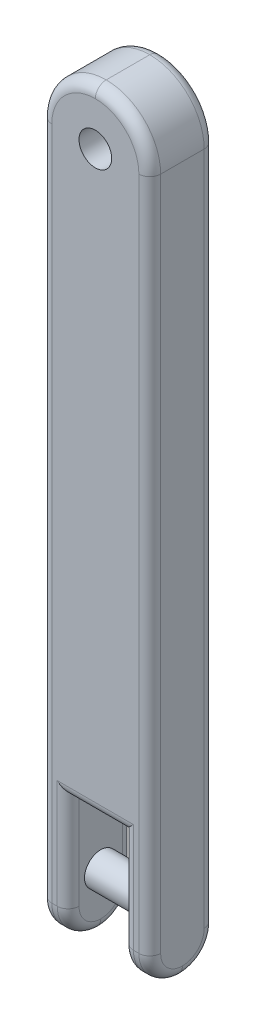
ISO-10303-21;
HEADER;
FILE_DESCRIPTION(('STEP AP214'),'2;1');
FILE_NAME('part.step','',(''),(''),'','','');
FILE_SCHEMA(('AUTOMOTIVE_DESIGN { 1 0 10303 214 1 1 1 1 }'));
ENDSEC;
DATA;
#1=APPLICATION_CONTEXT('core data for automotive mechanical design processes');
#2=APPLICATION_PROTOCOL_DEFINITION('international standard','automotive_design',2000,#1);
#3=PRODUCT_CONTEXT('',#1,'mechanical');
#4=PRODUCT('Part','Part','',(#3));
#5=PRODUCT_RELATED_PRODUCT_CATEGORY('part','',(#4));
#6=PRODUCT_DEFINITION_FORMATION('','',#4);
#7=PRODUCT_DEFINITION_CONTEXT('part definition',#1,'design');
#8=PRODUCT_DEFINITION('design','',#6,#7);
#9=PRODUCT_DEFINITION_SHAPE('','',#8);
#10=(LENGTH_UNIT() NAMED_UNIT(*) SI_UNIT(.MILLI.,.METRE.));
#11=(NAMED_UNIT(*) PLANE_ANGLE_UNIT() SI_UNIT($,.RADIAN.));
#12=(NAMED_UNIT(*) SI_UNIT($,.STERADIAN.) SOLID_ANGLE_UNIT());
#13=UNCERTAINTY_MEASURE_WITH_UNIT(LENGTH_MEASURE(1.E-05),#10,'distance_accuracy_value','');
#14=(GEOMETRIC_REPRESENTATION_CONTEXT(3) GLOBAL_UNCERTAINTY_ASSIGNED_CONTEXT((#13)) GLOBAL_UNIT_ASSIGNED_CONTEXT((#10,
#11,#12)) REPRESENTATION_CONTEXT('',''));
#15=CARTESIAN_POINT('',(0.,0.,0.));
#16=DIRECTION('',(0.,0.,1.));
#17=DIRECTION('',(1.,0.,0.));
#18=AXIS2_PLACEMENT_3D('',#15,#16,#17);
#19=CARTESIAN_POINT('',(0.,0.,30.));
#20=DIRECTION('',(1.,0.,0.));
#21=DIRECTION('',(0.,0.,-1.));
#22=AXIS2_PLACEMENT_3D('',#19,#20,#21);
#23=PLANE('',#22);
#24=CARTESIAN_POINT('',(0.,15.,15.));
#25=DIRECTION('',(1.,0.,0.));
#26=DIRECTION('',(0.,0.,-1.));
#27=AXIS2_PLACEMENT_3D('',#24,#25,#26);
#28=CIRCLE('',#27,10.);
#29=CARTESIAN_POINT('',(0.,5.,15.));
#30=VERTEX_POINT('',#29);
#31=CARTESIAN_POINT('',(0.,15.,5.));
#32=VERTEX_POINT('',#31);
#33=EDGE_CURVE('E349',#30,#32,#28,.T.);
#34=ORIENTED_EDGE('',*,*,#33,.F.);
#35=CARTESIAN_POINT('',(0.,15.,15.));
#36=DIRECTION('',(1.,0.,0.));
#37=DIRECTION('',(0.,0.,-1.));
#38=AXIS2_PLACEMENT_3D('',#35,#36,#37);
#39=CIRCLE('',#38,10.);
#40=CARTESIAN_POINT('',(0.,15.,25.));
#41=VERTEX_POINT('',#40);
#42=EDGE_CURVE('E346',#41,#30,#39,.T.);
#43=ORIENTED_EDGE('',*,*,#42,.F.);
#44=DIRECTION('',(0.,-1.,0.));
#45=VECTOR('',#44,1.);
#46=CARTESIAN_POINT('',(0.,0.,25.));
#47=LINE('',#46,#45);
#48=CARTESIAN_POINT('',(0.,325.,25.));
#49=VERTEX_POINT('',#48);
#50=EDGE_CURVE('E235',#41,#49,#47,.F.);
#51=ORIENTED_EDGE('',*,*,#50,.T.);
#52=DIRECTION('',(0.,0.,-1.));
#53=VECTOR('',#52,1.);
#54=CARTESIAN_POINT('',(0.,325.,30.));
#55=LINE('',#54,#53);
#56=CARTESIAN_POINT('',(0.,325.,5.));
#57=VERTEX_POINT('',#56);
#58=EDGE_CURVE('E218',#49,#57,#55,.T.);
#59=ORIENTED_EDGE('',*,*,#58,.T.);
#60=DIRECTION('',(0.,-1.,0.));
#61=VECTOR('',#60,1.);
#62=CARTESIAN_POINT('',(0.,0.,5.));
#63=LINE('',#62,#61);
#64=EDGE_CURVE('E243',#57,#32,#63,.T.);
#65=ORIENTED_EDGE('',*,*,#64,.T.);
#66=EDGE_LOOP('',(#34,#43,#51,#59,#65));
#67=FACE_BOUND('',#66,.T.);
#68=ADVANCED_FACE('F42',(#67),#23,.F.);
#69=CARTESIAN_POINT('',(12.5,0.,30.));
#70=DIRECTION('',(-1.,0.,0.));
#71=DIRECTION('',(0.,0.,1.));
#72=AXIS2_PLACEMENT_3D('',#69,#70,#71);
#73=PLANE('',#72);
#74=CARTESIAN_POINT('',(12.5,25.,15.));
#75=DIRECTION('',(-1.,0.,0.));
#76=DIRECTION('',(0.,0.,1.));
#77=AXIS2_PLACEMENT_3D('',#74,#75,#76);
#78=CIRCLE('',#77,7.5);
#79=CARTESIAN_POINT('',(12.5,25.,22.5));
#80=VERTEX_POINT('',#79);
#81=EDGE_CURVE('E517',#80,#80,#78,.T.);
#82=ORIENTED_EDGE('',*,*,#81,.T.);
#83=EDGE_LOOP('',(#82));
#84=FACE_BOUND('',#83,.T.);
#85=CARTESIAN_POINT('',(12.5,15.,15.));
#86=DIRECTION('',(-1.,0.,0.));
#87=DIRECTION('',(0.,0.,1.));
#88=AXIS2_PLACEMENT_3D('',#85,#86,#87);
#89=CIRCLE('',#88,10.);
#90=CARTESIAN_POINT('',(12.5,15.,5.));
#91=VERTEX_POINT('',#90);
#92=CARTESIAN_POINT('',(12.5,5.,15.));
#93=VERTEX_POINT('',#92);
#94=EDGE_CURVE('E339',#91,#93,#89,.T.);
#95=ORIENTED_EDGE('',*,*,#94,.F.);
#96=DIRECTION('',(0.,1.,0.));
#97=VECTOR('',#96,1.);
#98=CARTESIAN_POINT('',(12.5,60.,5.));
#99=LINE('',#98,#97);
#100=CARTESIAN_POINT('',(12.5,60.,5.));
#101=VERTEX_POINT('',#100);
#102=EDGE_CURVE('E217',#91,#101,#99,.T.);
#103=ORIENTED_EDGE('',*,*,#102,.T.);
#104=DIRECTION('',(0.,0.,-1.));
#105=VECTOR('',#104,1.);
#106=CARTESIAN_POINT('',(12.5,60.,30.));
#107=LINE('',#106,#105);
#108=CARTESIAN_POINT('',(12.5,60.,25.));
#109=VERTEX_POINT('',#108);
#110=EDGE_CURVE('E199',#109,#101,#107,.T.);
#111=ORIENTED_EDGE('',*,*,#110,.F.);
#112=DIRECTION('',(0.,1.,0.));
#113=VECTOR('',#112,1.);
#114=CARTESIAN_POINT('',(12.5,0.,25.));
#115=LINE('',#114,#113);
#116=CARTESIAN_POINT('',(12.5,15.,25.));
#117=VERTEX_POINT('',#116);
#118=EDGE_CURVE('E215',#109,#117,#115,.F.);
#119=ORIENTED_EDGE('',*,*,#118,.T.);
#120=CARTESIAN_POINT('',(12.5,15.,15.));
#121=DIRECTION('',(-1.,0.,0.));
#122=DIRECTION('',(0.,0.,1.));
#123=AXIS2_PLACEMENT_3D('',#120,#121,#122);
#124=CIRCLE('',#123,10.);
#125=EDGE_CURVE('E337',#93,#117,#124,.T.);
#126=ORIENTED_EDGE('',*,*,#125,.F.);
#127=EDGE_LOOP('',(#95,#103,#111,#119,#126));
#128=FACE_BOUND('',#127,.T.);
#129=ADVANCED_FACE('F213',(#84,#128),#73,.F.);
#130=CARTESIAN_POINT('',(37.5,60.,30.));
#131=DIRECTION('',(1.,0.,0.));
#132=DIRECTION('',(0.,1.,0.));
#133=AXIS2_PLACEMENT_3D('',#130,#131,#132);
#134=PLANE('',#133);
#135=CARTESIAN_POINT('',(37.5,25.,15.));
#136=DIRECTION('',(1.,0.,0.));
#137=DIRECTION('',(0.,1.,0.));
#138=AXIS2_PLACEMENT_3D('',#135,#136,#137);
#139=CIRCLE('',#138,7.5);
#140=CARTESIAN_POINT('',(37.5,32.5,15.));
#141=VERTEX_POINT('',#140);
#142=EDGE_CURVE('E301',#141,#141,#139,.T.);
#143=ORIENTED_EDGE('',*,*,#142,.T.);
#144=EDGE_LOOP('',(#143));
#145=FACE_BOUND('',#144,.T.);
#146=CARTESIAN_POINT('',(37.5,15.,15.));
#147=DIRECTION('',(1.,0.,0.));
#148=DIRECTION('',(0.,1.,0.));
#149=AXIS2_PLACEMENT_3D('',#146,#147,#148);
#150=CIRCLE('',#149,10.);
#151=CARTESIAN_POINT('',(37.5,5.,15.));
#152=VERTEX_POINT('',#151);
#153=CARTESIAN_POINT('',(37.5,15.,5.));
#154=VERTEX_POINT('',#153);
#155=EDGE_CURVE('E332',#152,#154,#150,.T.);
#156=ORIENTED_EDGE('',*,*,#155,.F.);
#157=CARTESIAN_POINT('',(37.5,15.,15.));
#158=DIRECTION('',(1.,0.,0.));
#159=DIRECTION('',(0.,1.,0.));
#160=AXIS2_PLACEMENT_3D('',#157,#158,#159);
#161=CIRCLE('',#160,10.);
#162=CARTESIAN_POINT('',(37.5,15.,25.));
#163=VERTEX_POINT('',#162);
#164=EDGE_CURVE('E329',#163,#152,#161,.T.);
#165=ORIENTED_EDGE('',*,*,#164,.F.);
#166=DIRECTION('',(0.,-1.,0.));
#167=VECTOR('',#166,1.);
#168=CARTESIAN_POINT('',(37.5,60.,25.));
#169=LINE('',#168,#167);
#170=CARTESIAN_POINT('',(37.5,60.,25.));
#171=VERTEX_POINT('',#170);
#172=EDGE_CURVE('E251',#163,#171,#169,.F.);
#173=ORIENTED_EDGE('',*,*,#172,.T.);
#174=DIRECTION('',(0.,0.,-1.));
#175=VECTOR('',#174,1.);
#176=CARTESIAN_POINT('',(37.5,60.,30.));
#177=LINE('',#176,#175);
#178=CARTESIAN_POINT('',(37.5,60.,5.));
#179=VERTEX_POINT('',#178);
#180=EDGE_CURVE('E202',#171,#179,#177,.T.);
#181=ORIENTED_EDGE('',*,*,#180,.T.);
#182=DIRECTION('',(0.,-1.,0.));
#183=VECTOR('',#182,1.);
#184=CARTESIAN_POINT('',(37.5,0.,5.));
#185=LINE('',#184,#183);
#186=EDGE_CURVE('E253',#179,#154,#185,.T.);
#187=ORIENTED_EDGE('',*,*,#186,.T.);
#188=EDGE_LOOP('',(#156,#165,#173,#181,#187));
#189=FACE_BOUND('',#188,.T.);
#190=ADVANCED_FACE('F423',(#145,#189),#134,.F.);
#191=CARTESIAN_POINT('',(50.,0.,30.));
#192=DIRECTION('',(-1.,0.,0.));
#193=DIRECTION('',(0.,0.,1.));
#194=AXIS2_PLACEMENT_3D('',#191,#192,#193);
#195=PLANE('',#194);
#196=CARTESIAN_POINT('',(50.,15.,15.));
#197=DIRECTION('',(-1.,0.,0.));
#198=DIRECTION('',(0.,0.,1.));
#199=AXIS2_PLACEMENT_3D('',#196,#197,#198);
#200=CIRCLE('',#199,10.);
#201=CARTESIAN_POINT('',(50.,15.,5.));
#202=VERTEX_POINT('',#201);
#203=CARTESIAN_POINT('',(50.,5.,15.));
#204=VERTEX_POINT('',#203);
#205=EDGE_CURVE('E327',#202,#204,#200,.T.);
#206=ORIENTED_EDGE('',*,*,#205,.F.);
#207=DIRECTION('',(0.,1.,0.));
#208=VECTOR('',#207,1.);
#209=CARTESIAN_POINT('',(50.,325.,5.));
#210=LINE('',#209,#208);
#211=CARTESIAN_POINT('',(50.,325.,5.));
#212=VERTEX_POINT('',#211);
#213=EDGE_CURVE('E249',#202,#212,#210,.T.);
#214=ORIENTED_EDGE('',*,*,#213,.T.);
#215=DIRECTION('',(0.,0.,-1.));
#216=VECTOR('',#215,1.);
#217=CARTESIAN_POINT('',(50.,325.,30.));
#218=LINE('',#217,#216);
#219=CARTESIAN_POINT('',(50.,325.,25.));
#220=VERTEX_POINT('',#219);
#221=EDGE_CURVE('E233',#212,#220,#218,.F.);
#222=ORIENTED_EDGE('',*,*,#221,.T.);
#223=DIRECTION('',(0.,1.,0.));
#224=VECTOR('',#223,1.);
#225=CARTESIAN_POINT('',(50.,0.,25.));
#226=LINE('',#225,#224);
#227=CARTESIAN_POINT('',(50.,15.,25.));
#228=VERTEX_POINT('',#227);
#229=EDGE_CURVE('E246',#220,#228,#226,.F.);
#230=ORIENTED_EDGE('',*,*,#229,.T.);
#231=CARTESIAN_POINT('',(50.,15.,15.));
#232=DIRECTION('',(-1.,0.,0.));
#233=DIRECTION('',(0.,0.,1.));
#234=AXIS2_PLACEMENT_3D('',#231,#232,#233);
#235=CIRCLE('',#234,10.);
#236=EDGE_CURVE('E293',#204,#228,#235,.T.);
#237=ORIENTED_EDGE('',*,*,#236,.F.);
#238=EDGE_LOOP('',(#206,#214,#222,#230,#237));
#239=FACE_BOUND('',#238,.T.);
#240=ADVANCED_FACE('F495',(#239),#195,.F.);
#241=CARTESIAN_POINT('',(0.,0.,30.));
#242=DIRECTION('',(0.,0.,-1.));
#243=DIRECTION('',(-1.,0.,0.));
#244=AXIS2_PLACEMENT_3D('',#241,#242,#243);
#245=PLANE('',#244);
#246=DIRECTION('',(0.,-1.,0.));
#247=VECTOR('',#246,1.);
#248=CARTESIAN_POINT('',(42.5,0.,30.));
#249=LINE('',#248,#247);
#250=CARTESIAN_POINT('',(42.5,65.,30.));
#251=VERTEX_POINT('',#250);
#252=CARTESIAN_POINT('',(42.5,15.,30.));
#253=VERTEX_POINT('',#252);
#254=EDGE_CURVE('E281',#251,#253,#249,.T.);
#255=ORIENTED_EDGE('',*,*,#254,.T.);
#256=DIRECTION('',(1.,0.,0.));
#257=VECTOR('',#256,1.);
#258=CARTESIAN_POINT('',(0.,15.,30.));
#259=LINE('',#258,#257);
#260=CARTESIAN_POINT('',(45.,15.,30.));
#261=VERTEX_POINT('',#260);
#262=EDGE_CURVE('E364',#253,#261,#259,.T.);
#263=ORIENTED_EDGE('',*,*,#262,.T.);
#264=DIRECTION('',(0.,1.,0.));
#265=VECTOR('',#264,1.);
#266=CARTESIAN_POINT('',(45.,0.,30.));
#267=LINE('',#266,#265);
#268=CARTESIAN_POINT('',(45.,325.,30.));
#269=VERTEX_POINT('',#268);
#270=EDGE_CURVE('E284',#261,#269,#267,.T.);
#271=ORIENTED_EDGE('',*,*,#270,.T.);
#272=CARTESIAN_POINT('',(25.,325.,30.));
#273=DIRECTION('',(0.,0.,-1.));
#274=DIRECTION('',(-1.,0.,0.));
#275=AXIS2_PLACEMENT_3D('',#272,#273,#274);
#276=CIRCLE('',#275,20.);
#277=CARTESIAN_POINT('',(25.,345.,30.));
#278=VERTEX_POINT('',#277);
#279=EDGE_CURVE('E286',#269,#278,#276,.F.);
#280=ORIENTED_EDGE('',*,*,#279,.T.);
#281=CARTESIAN_POINT('',(25.,325.,30.));
#282=DIRECTION('',(0.,0.,-1.));
#283=DIRECTION('',(-1.,0.,0.));
#284=AXIS2_PLACEMENT_3D('',#281,#282,#283);
#285=CIRCLE('',#284,20.);
#286=CARTESIAN_POINT('',(5.,325.,30.));
#287=VERTEX_POINT('',#286);
#288=EDGE_CURVE('E288',#278,#287,#285,.F.);
#289=ORIENTED_EDGE('',*,*,#288,.T.);
#290=DIRECTION('',(0.,-1.,0.));
#291=VECTOR('',#290,1.);
#292=CARTESIAN_POINT('',(5.,0.,30.));
#293=LINE('',#292,#291);
#294=CARTESIAN_POINT('',(5.,15.,30.));
#295=VERTEX_POINT('',#294);
#296=EDGE_CURVE('E290',#287,#295,#293,.T.);
#297=ORIENTED_EDGE('',*,*,#296,.T.);
#298=DIRECTION('',(1.,0.,0.));
#299=VECTOR('',#298,1.);
#300=CARTESIAN_POINT('',(0.,15.,30.));
#301=LINE('',#300,#299);
#302=CARTESIAN_POINT('',(7.5,15.,30.));
#303=VERTEX_POINT('',#302);
#304=EDGE_CURVE('E362',#295,#303,#301,.T.);
#305=ORIENTED_EDGE('',*,*,#304,.T.);
#306=DIRECTION('',(0.,1.,0.));
#307=VECTOR('',#306,1.);
#308=CARTESIAN_POINT('',(7.5,0.,30.));
#309=LINE('',#308,#307);
#310=CARTESIAN_POINT('',(7.5,65.,30.));
#311=VERTEX_POINT('',#310);
#312=EDGE_CURVE('E279',#303,#311,#309,.T.);
#313=ORIENTED_EDGE('',*,*,#312,.T.);
#314=DIRECTION('',(1.,0.,0.));
#315=VECTOR('',#314,1.);
#316=CARTESIAN_POINT('',(0.,65.,30.));
#317=LINE('',#316,#315);
#318=EDGE_CURVE('E224',#311,#251,#317,.T.);
#319=ORIENTED_EDGE('',*,*,#318,.T.);
#320=EDGE_LOOP('',(#255,#263,#271,#280,#289,#297,#305,#313,#319));
#321=FACE_BOUND('',#320,.T.);
#322=CARTESIAN_POINT('',(25.,325.,30.));
#323=DIRECTION('',(0.,0.,1.));
#324=DIRECTION('',(1.,0.,0.));
#325=AXIS2_PLACEMENT_3D('',#322,#323,#324);
#326=CIRCLE('',#325,7.5);
#327=CARTESIAN_POINT('',(32.5,325.,30.));
#328=VERTEX_POINT('',#327);
#329=EDGE_CURVE('E425',#328,#328,#326,.T.);
#330=ORIENTED_EDGE('',*,*,#329,.F.);
#331=EDGE_LOOP('',(#330));
#332=FACE_BOUND('',#331,.T.);
#333=ADVANCED_FACE('F451',(#321,#332),#245,.F.);
#334=CARTESIAN_POINT('',(0.,0.,0.));
#335=DIRECTION('',(0.,0.,-1.));
#336=DIRECTION('',(-1.,0.,0.));
#337=AXIS2_PLACEMENT_3D('',#334,#335,#336);
#338=PLANE('',#337);
#339=DIRECTION('',(0.,1.,0.));
#340=VECTOR('',#339,1.);
#341=CARTESIAN_POINT('',(7.5,0.,0.));
#342=LINE('',#341,#340);
#343=CARTESIAN_POINT('',(7.5,65.,0.));
#344=VERTEX_POINT('',#343);
#345=CARTESIAN_POINT('',(7.5,15.,0.));
#346=VERTEX_POINT('',#345);
#347=EDGE_CURVE('E266',#344,#346,#342,.F.);
#348=ORIENTED_EDGE('',*,*,#347,.T.);
#349=DIRECTION('',(1.,0.,0.));
#350=VECTOR('',#349,1.);
#351=CARTESIAN_POINT('',(5.,15.,0.));
#352=LINE('',#351,#350);
#353=CARTESIAN_POINT('',(5.,15.,0.));
#354=VERTEX_POINT('',#353);
#355=EDGE_CURVE('E324',#346,#354,#352,.F.);
#356=ORIENTED_EDGE('',*,*,#355,.T.);
#357=DIRECTION('',(0.,-1.,0.));
#358=VECTOR('',#357,1.);
#359=CARTESIAN_POINT('',(5.,325.,0.));
#360=LINE('',#359,#358);
#361=CARTESIAN_POINT('',(5.,325.,0.));
#362=VERTEX_POINT('',#361);
#363=EDGE_CURVE('E262',#354,#362,#360,.F.);
#364=ORIENTED_EDGE('',*,*,#363,.T.);
#365=CARTESIAN_POINT('',(25.,325.,0.));
#366=DIRECTION('',(0.,0.,-1.));
#367=DIRECTION('',(-1.,0.,0.));
#368=AXIS2_PLACEMENT_3D('',#365,#366,#367);
#369=CIRCLE('',#368,20.);
#370=CARTESIAN_POINT('',(25.,345.,0.));
#371=VERTEX_POINT('',#370);
#372=EDGE_CURVE('E256',#362,#371,#369,.T.);
#373=ORIENTED_EDGE('',*,*,#372,.T.);
#374=CARTESIAN_POINT('',(25.,325.,0.));
#375=DIRECTION('',(0.,0.,-1.));
#376=DIRECTION('',(-1.,0.,0.));
#377=AXIS2_PLACEMENT_3D('',#374,#375,#376);
#378=CIRCLE('',#377,20.);
#379=CARTESIAN_POINT('',(45.,325.,0.));
#380=VERTEX_POINT('',#379);
#381=EDGE_CURVE('E258',#371,#380,#378,.T.);
#382=ORIENTED_EDGE('',*,*,#381,.T.);
#383=DIRECTION('',(0.,1.,0.));
#384=VECTOR('',#383,1.);
#385=CARTESIAN_POINT('',(45.,0.,0.));
#386=LINE('',#385,#384);
#387=CARTESIAN_POINT('',(45.,15.,0.));
#388=VERTEX_POINT('',#387);
#389=EDGE_CURVE('E260',#380,#388,#386,.F.);
#390=ORIENTED_EDGE('',*,*,#389,.T.);
#391=DIRECTION('',(1.,0.,0.));
#392=VECTOR('',#391,1.);
#393=CARTESIAN_POINT('',(42.5,15.,0.));
#394=LINE('',#393,#392);
#395=CARTESIAN_POINT('',(42.5,15.,0.));
#396=VERTEX_POINT('',#395);
#397=EDGE_CURVE('E366',#388,#396,#394,.F.);
#398=ORIENTED_EDGE('',*,*,#397,.T.);
#399=DIRECTION('',(0.,-1.,0.));
#400=VECTOR('',#399,1.);
#401=CARTESIAN_POINT('',(42.5,60.,0.));
#402=LINE('',#401,#400);
#403=CARTESIAN_POINT('',(42.5,65.,0.));
#404=VERTEX_POINT('',#403);
#405=EDGE_CURVE('E208',#396,#404,#402,.F.);
#406=ORIENTED_EDGE('',*,*,#405,.T.);
#407=DIRECTION('',(1.,0.,0.));
#408=VECTOR('',#407,1.);
#409=CARTESIAN_POINT('',(12.5,65.,0.));
#410=LINE('',#409,#408);
#411=EDGE_CURVE('E264',#404,#344,#410,.F.);
#412=ORIENTED_EDGE('',*,*,#411,.T.);
#413=EDGE_LOOP('',(#348,#356,#364,#373,#382,#390,#398,#406,#412));
#414=FACE_BOUND('',#413,.T.);
#415=CARTESIAN_POINT('',(25.,325.,0.));
#416=DIRECTION('',(0.,0.,1.));
#417=DIRECTION('',(1.,0.,0.));
#418=AXIS2_PLACEMENT_3D('',#415,#416,#417);
#419=CIRCLE('',#418,7.5);
#420=CARTESIAN_POINT('',(32.5,325.,0.));
#421=VERTEX_POINT('',#420);
#422=EDGE_CURVE('E512',#421,#421,#419,.T.);
#423=ORIENTED_EDGE('',*,*,#422,.T.);
#424=EDGE_LOOP('',(#423));
#425=FACE_BOUND('',#424,.T.);
#426=ADVANCED_FACE('F470',(#414,#425),#338,.T.);
#427=CARTESIAN_POINT('',(12.5,60.,30.));
#428=DIRECTION('',(0.,1.,0.));
#429=DIRECTION('',(0.,0.,1.));
#430=AXIS2_PLACEMENT_3D('',#427,#428,#429);
#431=PLANE('',#430);
#432=ORIENTED_EDGE('',*,*,#110,.T.);
#433=DIRECTION('',(1.,0.,0.));
#434=VECTOR('',#433,1.);
#435=CARTESIAN_POINT('',(37.5,60.,5.));
#436=LINE('',#435,#434);
#437=EDGE_CURVE('E207',#101,#179,#436,.T.);
#438=ORIENTED_EDGE('',*,*,#437,.T.);
#439=ORIENTED_EDGE('',*,*,#180,.F.);
#440=DIRECTION('',(1.,0.,0.));
#441=VECTOR('',#440,1.);
#442=CARTESIAN_POINT('',(12.5,60.,25.));
#443=LINE('',#442,#441);
#444=EDGE_CURVE('E196',#171,#109,#443,.F.);
#445=ORIENTED_EDGE('',*,*,#444,.T.);
#446=EDGE_LOOP('',(#432,#438,#439,#445));
#447=FACE_BOUND('',#446,.T.);
#448=ADVANCED_FACE('F198',(#447),#431,.F.);
#449=CARTESIAN_POINT('',(25.,325.,30.));
#450=DIRECTION('',(0.,0.,-1.));
#451=DIRECTION('',(-1.,0.,0.));
#452=AXIS2_PLACEMENT_3D('',#449,#450,#451);
#453=CYLINDRICAL_SURFACE('',#452,7.5);
#454=ORIENTED_EDGE('',*,*,#329,.T.);
#455=EDGE_LOOP('',(#454));
#456=FACE_BOUND('',#455,.T.);
#457=ORIENTED_EDGE('',*,*,#422,.F.);
#458=EDGE_LOOP('',(#457));
#459=FACE_BOUND('',#458,.T.);
#460=ADVANCED_FACE('F544',(#456,#459),#453,.F.);
#461=CARTESIAN_POINT('',(25.,325.,30.));
#462=DIRECTION('',(0.,0.,-1.));
#463=DIRECTION('',(-1.,0.,0.));
#464=AXIS2_PLACEMENT_3D('',#461,#462,#463);
#465=CYLINDRICAL_SURFACE('',#464,25.);
#466=ORIENTED_EDGE('',*,*,#221,.F.);
#467=CARTESIAN_POINT('',(25.,325.,5.));
#468=DIRECTION('',(0.,0.,-1.));
#469=DIRECTION('',(-1.,0.,0.));
#470=AXIS2_PLACEMENT_3D('',#467,#468,#469);
#471=CIRCLE('',#470,25.);
#472=CARTESIAN_POINT('',(25.,350.,5.));
#473=VERTEX_POINT('',#472);
#474=EDGE_CURVE('E272',#212,#473,#471,.F.);
#475=ORIENTED_EDGE('',*,*,#474,.T.);
#476=DIRECTION('',(0.,0.,-1.));
#477=VECTOR('',#476,1.);
#478=CARTESIAN_POINT('',(25.,350.,30.));
#479=LINE('',#478,#477);
#480=CARTESIAN_POINT('',(25.,350.,25.));
#481=VERTEX_POINT('',#480);
#482=EDGE_CURVE('E240',#481,#473,#479,.T.);
#483=ORIENTED_EDGE('',*,*,#482,.F.);
#484=CARTESIAN_POINT('',(25.,325.,25.));
#485=DIRECTION('',(0.,0.,-1.));
#486=DIRECTION('',(-1.,0.,0.));
#487=AXIS2_PLACEMENT_3D('',#484,#485,#486);
#488=CIRCLE('',#487,25.);
#489=EDGE_CURVE('E270',#481,#220,#488,.T.);
#490=ORIENTED_EDGE('',*,*,#489,.T.);
#491=EDGE_LOOP('',(#466,#475,#483,#490));
#492=FACE_BOUND('',#491,.T.);
#493=ADVANCED_FACE('F497',(#492),#465,.T.);
#494=CARTESIAN_POINT('',(25.,325.,30.));
#495=DIRECTION('',(0.,0.,-1.));
#496=DIRECTION('',(-1.,0.,0.));
#497=AXIS2_PLACEMENT_3D('',#494,#495,#496);
#498=CYLINDRICAL_SURFACE('',#497,25.);
#499=ORIENTED_EDGE('',*,*,#482,.T.);
#500=CARTESIAN_POINT('',(25.,325.,5.));
#501=DIRECTION('',(0.,0.,-1.));
#502=DIRECTION('',(-1.,0.,0.));
#503=AXIS2_PLACEMENT_3D('',#500,#501,#502);
#504=CIRCLE('',#503,25.);
#505=EDGE_CURVE('E276',#473,#57,#504,.F.);
#506=ORIENTED_EDGE('',*,*,#505,.T.);
#507=ORIENTED_EDGE('',*,*,#58,.F.);
#508=CARTESIAN_POINT('',(25.,325.,25.));
#509=DIRECTION('',(0.,0.,-1.));
#510=DIRECTION('',(-1.,0.,0.));
#511=AXIS2_PLACEMENT_3D('',#508,#509,#510);
#512=CIRCLE('',#511,25.);
#513=EDGE_CURVE('E274',#49,#481,#512,.T.);
#514=ORIENTED_EDGE('',*,*,#513,.T.);
#515=EDGE_LOOP('',(#499,#506,#507,#514));
#516=FACE_BOUND('',#515,.T.);
#517=ADVANCED_FACE('F509',(#516),#498,.T.);
#518=CARTESIAN_POINT('',(50.,25.,15.));
#519=DIRECTION('',(-1.,0.,0.));
#520=DIRECTION('',(0.,0.,1.));
#521=AXIS2_PLACEMENT_3D('',#518,#519,#520);
#522=CYLINDRICAL_SURFACE('',#521,7.5);
#523=ORIENTED_EDGE('',*,*,#142,.F.);
#524=EDGE_LOOP('',(#523));
#525=FACE_BOUND('',#524,.T.);
#526=ORIENTED_EDGE('',*,*,#81,.F.);
#527=EDGE_LOOP('',(#526));
#528=FACE_BOUND('',#527,.T.);
#529=ADVANCED_FACE('F524',(#525,#528),#522,.T.);
#530=CARTESIAN_POINT('',(42.5,0.,25.));
#531=DIRECTION('',(0.,-1.,0.));
#532=DIRECTION('',(1.,0.,0.));
#533=AXIS2_PLACEMENT_3D('',#530,#531,#532);
#534=CYLINDRICAL_SURFACE('',#533,5.);
#535=ORIENTED_EDGE('',*,*,#172,.F.);
#536=CARTESIAN_POINT('',(42.5,15.,25.));
#537=DIRECTION('',(0.,1.,0.));
#538=DIRECTION('',(0.,0.,1.));
#539=AXIS2_PLACEMENT_3D('',#536,#537,#538);
#540=CIRCLE('',#539,5.);
#541=EDGE_CURVE('E355',#163,#253,#540,.T.);
#542=ORIENTED_EDGE('',*,*,#541,.T.);
#543=ORIENTED_EDGE('',*,*,#254,.F.);
#544=CARTESIAN_POINT('',(42.5,65.,25.));
#545=DIRECTION('',(0.707106781186548,-0.707106781186547,0.));
#546=DIRECTION('',(-0.707106781186547,-0.707106781186548,0.));
#547=AXIS2_PLACEMENT_3D('',#544,#545,#546);
#548=ELLIPSE('',#547,7.07106781186547,5.);
#549=EDGE_CURVE('E299',#171,#251,#548,.F.);
#550=ORIENTED_EDGE('',*,*,#549,.F.);
#551=EDGE_LOOP('',(#535,#542,#543,#550));
#552=FACE_BOUND('',#551,.T.);
#553=ADVANCED_FACE('F448',(#552),#534,.T.);
#554=CARTESIAN_POINT('',(42.5,60.,5.));
#555=DIRECTION('',(0.,1.,0.));
#556=DIRECTION('',(-1.,0.,0.));
#557=AXIS2_PLACEMENT_3D('',#554,#555,#556);
#558=CYLINDRICAL_SURFACE('',#557,5.);
#559=ORIENTED_EDGE('',*,*,#405,.F.);
#560=CARTESIAN_POINT('',(42.5,15.,5.));
#561=DIRECTION('',(0.,1.,0.));
#562=DIRECTION('',(0.,0.,1.));
#563=AXIS2_PLACEMENT_3D('',#560,#561,#562);
#564=CIRCLE('',#563,5.);
#565=EDGE_CURVE('E335',#396,#154,#564,.T.);
#566=ORIENTED_EDGE('',*,*,#565,.T.);
#567=ORIENTED_EDGE('',*,*,#186,.F.);
#568=CARTESIAN_POINT('',(42.5,65.,5.));
#569=DIRECTION('',(-0.707106781186548,0.707106781186547,0.));
#570=DIRECTION('',(0.707106781186547,0.707106781186548,0.));
#571=AXIS2_PLACEMENT_3D('',#568,#569,#570);
#572=ELLIPSE('',#571,7.07106781186547,5.);
#573=EDGE_CURVE('E227',#404,#179,#572,.T.);
#574=ORIENTED_EDGE('',*,*,#573,.F.);
#575=EDGE_LOOP('',(#559,#566,#567,#574));
#576=FACE_BOUND('',#575,.T.);
#577=ADVANCED_FACE('F429',(#576),#558,.T.);
#578=CARTESIAN_POINT('',(0.,65.,25.));
#579=DIRECTION('',(1.,0.,0.));
#580=DIRECTION('',(0.,0.,-1.));
#581=AXIS2_PLACEMENT_3D('',#578,#579,#580);
#582=CYLINDRICAL_SURFACE('',#581,5.);
#583=ORIENTED_EDGE('',*,*,#549,.T.);
#584=ORIENTED_EDGE('',*,*,#318,.F.);
#585=CARTESIAN_POINT('',(7.5,65.,25.));
#586=DIRECTION('',(0.707106781186547,0.707106781186547,0.));
#587=DIRECTION('',(-0.707106781186547,0.707106781186547,0.));
#588=AXIS2_PLACEMENT_3D('',#585,#586,#587);
#589=ELLIPSE('',#588,7.07106781186547,5.);
#590=EDGE_CURVE('E222',#109,#311,#589,.F.);
#591=ORIENTED_EDGE('',*,*,#590,.F.);
#592=ORIENTED_EDGE('',*,*,#444,.F.);
#593=EDGE_LOOP('',(#583,#584,#591,#592));
#594=FACE_BOUND('',#593,.T.);
#595=ADVANCED_FACE('F223',(#594),#582,.T.);
#596=CARTESIAN_POINT('',(12.5,65.,5.));
#597=DIRECTION('',(-1.,0.,0.));
#598=DIRECTION('',(0.,0.,1.));
#599=AXIS2_PLACEMENT_3D('',#596,#597,#598);
#600=CYLINDRICAL_SURFACE('',#599,5.);
#601=ORIENTED_EDGE('',*,*,#573,.T.);
#602=ORIENTED_EDGE('',*,*,#437,.F.);
#603=CARTESIAN_POINT('',(7.5,65.,5.));
#604=DIRECTION('',(-0.707106781186547,-0.707106781186547,0.));
#605=DIRECTION('',(0.707106781186547,-0.707106781186547,0.));
#606=AXIS2_PLACEMENT_3D('',#603,#604,#605);
#607=ELLIPSE('',#606,7.07106781186547,5.);
#608=EDGE_CURVE('E228',#344,#101,#607,.T.);
#609=ORIENTED_EDGE('',*,*,#608,.F.);
#610=ORIENTED_EDGE('',*,*,#411,.F.);
#611=EDGE_LOOP('',(#601,#602,#609,#610));
#612=FACE_BOUND('',#611,.T.);
#613=ADVANCED_FACE('F419',(#612),#600,.T.);
#614=CARTESIAN_POINT('',(7.5,0.,25.));
#615=DIRECTION('',(0.,1.,0.));
#616=DIRECTION('',(0.,0.,1.));
#617=AXIS2_PLACEMENT_3D('',#614,#615,#616);
#618=CYLINDRICAL_SURFACE('',#617,5.);
#619=ORIENTED_EDGE('',*,*,#312,.F.);
#620=CARTESIAN_POINT('',(7.5,15.,25.));
#621=DIRECTION('',(0.,1.,0.));
#622=DIRECTION('',(0.,0.,1.));
#623=AXIS2_PLACEMENT_3D('',#620,#621,#622);
#624=CIRCLE('',#623,5.);
#625=EDGE_CURVE('E232',#303,#117,#624,.T.);
#626=ORIENTED_EDGE('',*,*,#625,.T.);
#627=ORIENTED_EDGE('',*,*,#118,.F.);
#628=ORIENTED_EDGE('',*,*,#590,.T.);
#629=EDGE_LOOP('',(#619,#626,#627,#628));
#630=FACE_BOUND('',#629,.T.);
#631=ADVANCED_FACE('F230',(#630),#618,.T.);
#632=CARTESIAN_POINT('',(7.5,0.,5.));
#633=DIRECTION('',(0.,-1.,0.));
#634=DIRECTION('',(0.,0.,-1.));
#635=AXIS2_PLACEMENT_3D('',#632,#633,#634);
#636=CYLINDRICAL_SURFACE('',#635,5.);
#637=ORIENTED_EDGE('',*,*,#102,.F.);
#638=CARTESIAN_POINT('',(7.5,15.,5.));
#639=DIRECTION('',(0.,1.,0.));
#640=DIRECTION('',(0.,0.,1.));
#641=AXIS2_PLACEMENT_3D('',#638,#639,#640);
#642=CIRCLE('',#641,5.);
#643=EDGE_CURVE('E67',#91,#346,#642,.T.);
#644=ORIENTED_EDGE('',*,*,#643,.T.);
#645=ORIENTED_EDGE('',*,*,#347,.F.);
#646=ORIENTED_EDGE('',*,*,#608,.T.);
#647=EDGE_LOOP('',(#637,#644,#645,#646));
#648=FACE_BOUND('',#647,.T.);
#649=ADVANCED_FACE('F415',(#648),#636,.T.);
#650=CARTESIAN_POINT('',(45.,0.,25.));
#651=DIRECTION('',(0.,1.,0.));
#652=DIRECTION('',(0.,0.,1.));
#653=AXIS2_PLACEMENT_3D('',#650,#651,#652);
#654=CYLINDRICAL_SURFACE('',#653,5.);
#655=ORIENTED_EDGE('',*,*,#270,.F.);
#656=CARTESIAN_POINT('',(45.,15.,25.));
#657=DIRECTION('',(0.,1.,0.));
#658=DIRECTION('',(0.,0.,1.));
#659=AXIS2_PLACEMENT_3D('',#656,#657,#658);
#660=CIRCLE('',#659,5.);
#661=EDGE_CURVE('E353',#261,#228,#660,.T.);
#662=ORIENTED_EDGE('',*,*,#661,.T.);
#663=ORIENTED_EDGE('',*,*,#229,.F.);
#664=CARTESIAN_POINT('',(45.,325.,25.));
#665=DIRECTION('',(0.,1.,0.));
#666=DIRECTION('',(0.,0.,1.));
#667=AXIS2_PLACEMENT_3D('',#664,#665,#666);
#668=CIRCLE('',#667,5.);
#669=EDGE_CURVE('E295',#269,#220,#668,.T.);
#670=ORIENTED_EDGE('',*,*,#669,.F.);
#671=EDGE_LOOP('',(#655,#662,#663,#670));
#672=FACE_BOUND('',#671,.T.);
#673=ADVANCED_FACE('F493',(#672),#654,.T.);
#674=CARTESIAN_POINT('',(45.,0.,5.));
#675=DIRECTION('',(0.,-1.,0.));
#676=DIRECTION('',(0.,0.,-1.));
#677=AXIS2_PLACEMENT_3D('',#674,#675,#676);
#678=CYLINDRICAL_SURFACE('',#677,5.);
#679=ORIENTED_EDGE('',*,*,#213,.F.);
#680=CARTESIAN_POINT('',(45.,15.,5.));
#681=DIRECTION('',(0.,1.,0.));
#682=DIRECTION('',(0.,0.,1.));
#683=AXIS2_PLACEMENT_3D('',#680,#681,#682);
#684=CIRCLE('',#683,5.);
#685=EDGE_CURVE('E59',#202,#388,#684,.T.);
#686=ORIENTED_EDGE('',*,*,#685,.T.);
#687=ORIENTED_EDGE('',*,*,#389,.F.);
#688=CARTESIAN_POINT('',(45.,325.,5.));
#689=DIRECTION('',(0.,1.,0.));
#690=DIRECTION('',(0.,0.,1.));
#691=AXIS2_PLACEMENT_3D('',#688,#689,#690);
#692=CIRCLE('',#691,5.);
#693=EDGE_CURVE('E315',#212,#380,#692,.T.);
#694=ORIENTED_EDGE('',*,*,#693,.F.);
#695=EDGE_LOOP('',(#679,#686,#687,#694));
#696=FACE_BOUND('',#695,.T.);
#697=ADVANCED_FACE('F481',(#696),#678,.T.);
#698=CARTESIAN_POINT('',(25.,325.,25.));
#699=DIRECTION('',(0.,0.,-1.));
#700=DIRECTION('',(-1.,0.,0.));
#701=AXIS2_PLACEMENT_3D('',#698,#699,#700);
#702=TOROIDAL_SURFACE('',#701,20.,5.);
#703=ORIENTED_EDGE('',*,*,#669,.T.);
#704=ORIENTED_EDGE('',*,*,#489,.F.);
#705=CARTESIAN_POINT('',(25.,345.,25.));
#706=DIRECTION('',(-1.,0.,0.));
#707=DIRECTION('',(0.,0.,1.));
#708=AXIS2_PLACEMENT_3D('',#705,#706,#707);
#709=CIRCLE('',#708,5.);
#710=EDGE_CURVE('E312',#278,#481,#709,.T.);
#711=ORIENTED_EDGE('',*,*,#710,.F.);
#712=ORIENTED_EDGE('',*,*,#279,.F.);
#713=EDGE_LOOP('',(#703,#704,#711,#712));
#714=FACE_BOUND('',#713,.T.);
#715=ADVANCED_FACE('F503',(#714),#702,.T.);
#716=CARTESIAN_POINT('',(25.,325.,5.));
#717=DIRECTION('',(0.,0.,-1.));
#718=DIRECTION('',(-1.,0.,0.));
#719=AXIS2_PLACEMENT_3D('',#716,#717,#718);
#720=TOROIDAL_SURFACE('',#719,20.,5.);
#721=ORIENTED_EDGE('',*,*,#693,.T.);
#722=ORIENTED_EDGE('',*,*,#381,.F.);
#723=CARTESIAN_POINT('',(25.,345.,5.));
#724=DIRECTION('',(-1.,0.,0.));
#725=DIRECTION('',(0.,0.,1.));
#726=AXIS2_PLACEMENT_3D('',#723,#724,#725);
#727=CIRCLE('',#726,5.);
#728=EDGE_CURVE('E309',#473,#371,#727,.T.);
#729=ORIENTED_EDGE('',*,*,#728,.F.);
#730=ORIENTED_EDGE('',*,*,#474,.F.);
#731=EDGE_LOOP('',(#721,#722,#729,#730));
#732=FACE_BOUND('',#731,.T.);
#733=ADVANCED_FACE('F479',(#732),#720,.T.);
#734=CARTESIAN_POINT('',(25.,325.,25.));
#735=DIRECTION('',(0.,0.,-1.));
#736=DIRECTION('',(-1.,0.,0.));
#737=AXIS2_PLACEMENT_3D('',#734,#735,#736);
#738=TOROIDAL_SURFACE('',#737,20.,5.);
#739=ORIENTED_EDGE('',*,*,#710,.T.);
#740=ORIENTED_EDGE('',*,*,#513,.F.);
#741=CARTESIAN_POINT('',(5.,325.,25.));
#742=DIRECTION('',(0.,-1.,0.));
#743=DIRECTION('',(0.,0.,-1.));
#744=AXIS2_PLACEMENT_3D('',#741,#742,#743);
#745=CIRCLE('',#744,5.);
#746=EDGE_CURVE('E305',#287,#49,#745,.T.);
#747=ORIENTED_EDGE('',*,*,#746,.F.);
#748=ORIENTED_EDGE('',*,*,#288,.F.);
#749=EDGE_LOOP('',(#739,#740,#747,#748));
#750=FACE_BOUND('',#749,.T.);
#751=ADVANCED_FACE('F507',(#750),#738,.T.);
#752=CARTESIAN_POINT('',(25.,325.,5.));
#753=DIRECTION('',(0.,0.,-1.));
#754=DIRECTION('',(-1.,0.,0.));
#755=AXIS2_PLACEMENT_3D('',#752,#753,#754);
#756=TOROIDAL_SURFACE('',#755,20.,5.);
#757=ORIENTED_EDGE('',*,*,#728,.T.);
#758=ORIENTED_EDGE('',*,*,#372,.F.);
#759=CARTESIAN_POINT('',(5.,325.,5.));
#760=DIRECTION('',(0.,-1.,0.));
#761=DIRECTION('',(0.,0.,-1.));
#762=AXIS2_PLACEMENT_3D('',#759,#760,#761);
#763=CIRCLE('',#762,5.);
#764=EDGE_CURVE('E302',#57,#362,#763,.T.);
#765=ORIENTED_EDGE('',*,*,#764,.F.);
#766=ORIENTED_EDGE('',*,*,#505,.F.);
#767=EDGE_LOOP('',(#757,#758,#765,#766));
#768=FACE_BOUND('',#767,.T.);
#769=ADVANCED_FACE('F474',(#768),#756,.T.);
#770=CARTESIAN_POINT('',(5.,0.,25.));
#771=DIRECTION('',(0.,-1.,0.));
#772=DIRECTION('',(0.,0.,-1.));
#773=AXIS2_PLACEMENT_3D('',#770,#771,#772);
#774=CYLINDRICAL_SURFACE('',#773,5.);
#775=ORIENTED_EDGE('',*,*,#50,.F.);
#776=CARTESIAN_POINT('',(5.,15.,25.));
#777=DIRECTION('',(0.,1.,0.));
#778=DIRECTION('',(0.,0.,1.));
#779=AXIS2_PLACEMENT_3D('',#776,#777,#778);
#780=CIRCLE('',#779,5.);
#781=EDGE_CURVE('E358',#41,#295,#780,.T.);
#782=ORIENTED_EDGE('',*,*,#781,.T.);
#783=ORIENTED_EDGE('',*,*,#296,.F.);
#784=ORIENTED_EDGE('',*,*,#746,.T.);
#785=EDGE_LOOP('',(#775,#782,#783,#784));
#786=FACE_BOUND('',#785,.T.);
#787=ADVANCED_FACE('F459',(#786),#774,.T.);
#788=CARTESIAN_POINT('',(5.,0.,5.));
#789=DIRECTION('',(0.,1.,0.));
#790=DIRECTION('',(0.,0.,1.));
#791=AXIS2_PLACEMENT_3D('',#788,#789,#790);
#792=CYLINDRICAL_SURFACE('',#791,5.);
#793=ORIENTED_EDGE('',*,*,#363,.F.);
#794=CARTESIAN_POINT('',(5.,15.,5.));
#795=DIRECTION('',(0.,1.,0.));
#796=DIRECTION('',(0.,0.,1.));
#797=AXIS2_PLACEMENT_3D('',#794,#795,#796);
#798=CIRCLE('',#797,5.);
#799=EDGE_CURVE('E342',#354,#32,#798,.T.);
#800=ORIENTED_EDGE('',*,*,#799,.T.);
#801=ORIENTED_EDGE('',*,*,#64,.F.);
#802=ORIENTED_EDGE('',*,*,#764,.T.);
#803=EDGE_LOOP('',(#793,#800,#801,#802));
#804=FACE_BOUND('',#803,.T.);
#805=ADVANCED_FACE('F467',(#804),#792,.T.);
#806=CARTESIAN_POINT('',(42.5,15.,15.));
#807=DIRECTION('',(1.,0.,0.));
#808=DIRECTION('',(0.,1.,0.));
#809=AXIS2_PLACEMENT_3D('',#806,#807,#808);
#810=TOROIDAL_SURFACE('',#809,10.,5.);
#811=ORIENTED_EDGE('',*,*,#164,.T.);
#812=CARTESIAN_POINT('',(42.5,5.,15.));
#813=DIRECTION('',(0.,0.,1.));
#814=DIRECTION('',(1.,0.,0.));
#815=AXIS2_PLACEMENT_3D('',#812,#813,#814);
#816=CIRCLE('',#815,5.);
#817=CARTESIAN_POINT('',(42.5,0.,15.));
#818=VERTEX_POINT('',#817);
#819=EDGE_CURVE('E11',#152,#818,#816,.T.);
#820=ORIENTED_EDGE('',*,*,#819,.T.);
#821=CARTESIAN_POINT('',(42.5,15.,15.));
#822=DIRECTION('',(1.,0.,0.));
#823=DIRECTION('',(0.,1.,0.));
#824=AXIS2_PLACEMENT_3D('',#821,#822,#823);
#825=CIRCLE('',#824,15.);
#826=EDGE_CURVE('E306',#253,#818,#825,.T.);
#827=ORIENTED_EDGE('',*,*,#826,.F.);
#828=ORIENTED_EDGE('',*,*,#541,.F.);
#829=EDGE_LOOP('',(#811,#820,#827,#828));
#830=FACE_BOUND('',#829,.T.);
#831=ADVANCED_FACE('F446',(#830),#810,.T.);
#832=CARTESIAN_POINT('',(45.,15.,15.));
#833=DIRECTION('',(-1.,0.,0.));
#834=DIRECTION('',(0.,0.,1.));
#835=AXIS2_PLACEMENT_3D('',#832,#833,#834);
#836=TOROIDAL_SURFACE('',#835,10.,5.);
#837=ORIENTED_EDGE('',*,*,#236,.T.);
#838=ORIENTED_EDGE('',*,*,#661,.F.);
#839=CARTESIAN_POINT('',(45.,15.,15.));
#840=DIRECTION('',(-1.,0.,0.));
#841=DIRECTION('',(0.,0.,1.));
#842=AXIS2_PLACEMENT_3D('',#839,#840,#841);
#843=CIRCLE('',#842,15.);
#844=CARTESIAN_POINT('',(45.,0.,15.));
#845=VERTEX_POINT('',#844);
#846=EDGE_CURVE('E378',#845,#261,#843,.T.);
#847=ORIENTED_EDGE('',*,*,#846,.F.);
#848=CARTESIAN_POINT('',(45.,5.,15.));
#849=DIRECTION('',(0.,0.,-1.));
#850=DIRECTION('',(-1.,0.,0.));
#851=AXIS2_PLACEMENT_3D('',#848,#849,#850);
#852=CIRCLE('',#851,5.);
#853=EDGE_CURVE('E320',#204,#845,#852,.T.);
#854=ORIENTED_EDGE('',*,*,#853,.F.);
#855=EDGE_LOOP('',(#837,#838,#847,#854));
#856=FACE_BOUND('',#855,.T.);
#857=ADVANCED_FACE('F489',(#856),#836,.T.);
#858=CARTESIAN_POINT('',(42.5,15.,15.));
#859=DIRECTION('',(1.,0.,0.));
#860=DIRECTION('',(0.,1.,0.));
#861=AXIS2_PLACEMENT_3D('',#858,#859,#860);
#862=TOROIDAL_SURFACE('',#861,10.,5.);
#863=ORIENTED_EDGE('',*,*,#155,.T.);
#864=ORIENTED_EDGE('',*,*,#565,.F.);
#865=CARTESIAN_POINT('',(42.5,15.,15.));
#866=DIRECTION('',(1.,0.,0.));
#867=DIRECTION('',(0.,1.,0.));
#868=AXIS2_PLACEMENT_3D('',#865,#866,#867);
#869=CIRCLE('',#868,15.);
#870=EDGE_CURVE('E375',#818,#396,#869,.T.);
#871=ORIENTED_EDGE('',*,*,#870,.F.);
#872=ORIENTED_EDGE('',*,*,#819,.F.);
#873=EDGE_LOOP('',(#863,#864,#871,#872));
#874=FACE_BOUND('',#873,.T.);
#875=ADVANCED_FACE('F433',(#874),#862,.T.);
#876=CARTESIAN_POINT('',(0.,15.,15.));
#877=DIRECTION('',(1.,0.,0.));
#878=DIRECTION('',(0.,0.,-1.));
#879=AXIS2_PLACEMENT_3D('',#876,#877,#878);
#880=CYLINDRICAL_SURFACE('',#879,15.);
#881=ORIENTED_EDGE('',*,*,#262,.F.);
#882=ORIENTED_EDGE('',*,*,#826,.T.);
#883=DIRECTION('',(1.,0.,0.));
#884=VECTOR('',#883,1.);
#885=CARTESIAN_POINT('',(37.5,0.,15.));
#886=LINE('',#885,#884);
#887=EDGE_CURVE('E372',#845,#818,#886,.F.);
#888=ORIENTED_EDGE('',*,*,#887,.F.);
#889=ORIENTED_EDGE('',*,*,#846,.T.);
#890=EDGE_LOOP('',(#881,#882,#888,#889));
#891=FACE_BOUND('',#890,.T.);
#892=ADVANCED_FACE('F442',(#891),#880,.T.);
#893=CARTESIAN_POINT('',(37.5,15.,15.));
#894=DIRECTION('',(-1.,0.,0.));
#895=DIRECTION('',(0.,0.,1.));
#896=AXIS2_PLACEMENT_3D('',#893,#894,#895);
#897=CYLINDRICAL_SURFACE('',#896,15.);
#898=ORIENTED_EDGE('',*,*,#870,.T.);
#899=ORIENTED_EDGE('',*,*,#397,.F.);
#900=CARTESIAN_POINT('',(45.,15.,15.));
#901=DIRECTION('',(-1.,0.,0.));
#902=DIRECTION('',(0.,0.,1.));
#903=AXIS2_PLACEMENT_3D('',#900,#901,#902);
#904=CIRCLE('',#903,15.);
#905=EDGE_CURVE('E369',#845,#388,#904,.F.);
#906=ORIENTED_EDGE('',*,*,#905,.F.);
#907=ORIENTED_EDGE('',*,*,#887,.T.);
#908=EDGE_LOOP('',(#898,#899,#906,#907));
#909=FACE_BOUND('',#908,.T.);
#910=ADVANCED_FACE('F437',(#909),#897,.T.);
#911=CARTESIAN_POINT('',(45.,15.,15.));
#912=DIRECTION('',(-1.,0.,0.));
#913=DIRECTION('',(0.,0.,1.));
#914=AXIS2_PLACEMENT_3D('',#911,#912,#913);
#915=TOROIDAL_SURFACE('',#914,10.,5.);
#916=ORIENTED_EDGE('',*,*,#853,.T.);
#917=ORIENTED_EDGE('',*,*,#905,.T.);
#918=ORIENTED_EDGE('',*,*,#685,.F.);
#919=ORIENTED_EDGE('',*,*,#205,.T.);
#920=EDGE_LOOP('',(#916,#917,#918,#919));
#921=FACE_BOUND('',#920,.T.);
#922=ADVANCED_FACE('F485',(#921),#915,.T.);
#923=CARTESIAN_POINT('',(5.,15.,15.));
#924=DIRECTION('',(1.,0.,0.));
#925=DIRECTION('',(0.,0.,-1.));
#926=AXIS2_PLACEMENT_3D('',#923,#924,#925);
#927=TOROIDAL_SURFACE('',#926,10.,5.);
#928=ORIENTED_EDGE('',*,*,#42,.T.);
#929=CARTESIAN_POINT('',(5.,5.,15.));
#930=DIRECTION('',(0.,0.,1.));
#931=DIRECTION('',(1.,0.,0.));
#932=AXIS2_PLACEMENT_3D('',#929,#930,#931);
#933=CIRCLE('',#932,5.);
#934=CARTESIAN_POINT('',(5.,0.,15.));
#935=VERTEX_POINT('',#934);
#936=EDGE_CURVE('E51',#30,#935,#933,.T.);
#937=ORIENTED_EDGE('',*,*,#936,.T.);
#938=CARTESIAN_POINT('',(5.,15.,15.));
#939=DIRECTION('',(1.,0.,0.));
#940=DIRECTION('',(0.,0.,-1.));
#941=AXIS2_PLACEMENT_3D('',#938,#939,#940);
#942=CIRCLE('',#941,15.);
#943=EDGE_CURVE('E46',#295,#935,#942,.T.);
#944=ORIENTED_EDGE('',*,*,#943,.F.);
#945=ORIENTED_EDGE('',*,*,#781,.F.);
#946=EDGE_LOOP('',(#928,#937,#944,#945));
#947=FACE_BOUND('',#946,.T.);
#948=ADVANCED_FACE('F44',(#947),#927,.T.);
#949=CARTESIAN_POINT('',(7.5,15.,15.));
#950=DIRECTION('',(-1.,0.,0.));
#951=DIRECTION('',(0.,0.,1.));
#952=AXIS2_PLACEMENT_3D('',#949,#950,#951);
#953=TOROIDAL_SURFACE('',#952,10.,5.);
#954=ORIENTED_EDGE('',*,*,#125,.T.);
#955=ORIENTED_EDGE('',*,*,#625,.F.);
#956=CARTESIAN_POINT('',(7.5,15.,15.));
#957=DIRECTION('',(-1.,0.,0.));
#958=DIRECTION('',(0.,0.,1.));
#959=AXIS2_PLACEMENT_3D('',#956,#957,#958);
#960=CIRCLE('',#959,15.);
#961=CARTESIAN_POINT('',(7.5,0.,15.));
#962=VERTEX_POINT('',#961);
#963=EDGE_CURVE('E391',#962,#303,#960,.T.);
#964=ORIENTED_EDGE('',*,*,#963,.F.);
#965=CARTESIAN_POINT('',(7.5,5.,15.));
#966=DIRECTION('',(0.,0.,-1.));
#967=DIRECTION('',(-1.,0.,0.));
#968=AXIS2_PLACEMENT_3D('',#965,#966,#967);
#969=CIRCLE('',#968,5.);
#970=EDGE_CURVE('E323',#93,#962,#969,.T.);
#971=ORIENTED_EDGE('',*,*,#970,.F.);
#972=EDGE_LOOP('',(#954,#955,#964,#971));
#973=FACE_BOUND('',#972,.T.);
#974=ADVANCED_FACE('F414',(#973),#953,.T.);
#975=CARTESIAN_POINT('',(5.,15.,15.));
#976=DIRECTION('',(1.,0.,0.));
#977=DIRECTION('',(0.,0.,-1.));
#978=AXIS2_PLACEMENT_3D('',#975,#976,#977);
#979=TOROIDAL_SURFACE('',#978,10.,5.);
#980=ORIENTED_EDGE('',*,*,#33,.T.);
#981=ORIENTED_EDGE('',*,*,#799,.F.);
#982=CARTESIAN_POINT('',(5.,15.,15.));
#983=DIRECTION('',(1.,0.,0.));
#984=DIRECTION('',(0.,0.,-1.));
#985=AXIS2_PLACEMENT_3D('',#982,#983,#984);
#986=CIRCLE('',#985,15.);
#987=EDGE_CURVE('E389',#935,#354,#986,.T.);
#988=ORIENTED_EDGE('',*,*,#987,.F.);
#989=ORIENTED_EDGE('',*,*,#936,.F.);
#990=EDGE_LOOP('',(#980,#981,#988,#989));
#991=FACE_BOUND('',#990,.T.);
#992=ADVANCED_FACE('F406',(#991),#979,.T.);
#993=CARTESIAN_POINT('',(0.,15.,15.));
#994=DIRECTION('',(1.,0.,0.));
#995=DIRECTION('',(0.,0.,-1.));
#996=AXIS2_PLACEMENT_3D('',#993,#994,#995);
#997=CYLINDRICAL_SURFACE('',#996,15.);
#998=ORIENTED_EDGE('',*,*,#304,.F.);
#999=ORIENTED_EDGE('',*,*,#943,.T.);
#1000=DIRECTION('',(1.,0.,0.));
#1001=VECTOR('',#1000,1.);
#1002=CARTESIAN_POINT('',(0.,0.,15.));
#1003=LINE('',#1002,#1001);
#1004=EDGE_CURVE('E386',#962,#935,#1003,.F.);
#1005=ORIENTED_EDGE('',*,*,#1004,.F.);
#1006=ORIENTED_EDGE('',*,*,#963,.T.);
#1007=EDGE_LOOP('',(#998,#999,#1005,#1006));
#1008=FACE_BOUND('',#1007,.T.);
#1009=ADVANCED_FACE('F399',(#1008),#997,.T.);
#1010=CARTESIAN_POINT('',(0.,15.,15.));
#1011=DIRECTION('',(-1.,0.,0.));
#1012=DIRECTION('',(0.,0.,1.));
#1013=AXIS2_PLACEMENT_3D('',#1010,#1011,#1012);
#1014=CYLINDRICAL_SURFACE('',#1013,15.);
#1015=ORIENTED_EDGE('',*,*,#987,.T.);
#1016=ORIENTED_EDGE('',*,*,#355,.F.);
#1017=CARTESIAN_POINT('',(7.5,15.,15.));
#1018=DIRECTION('',(-1.,0.,0.));
#1019=DIRECTION('',(0.,0.,1.));
#1020=AXIS2_PLACEMENT_3D('',#1017,#1018,#1019);
#1021=CIRCLE('',#1020,15.);
#1022=EDGE_CURVE('E383',#962,#346,#1021,.F.);
#1023=ORIENTED_EDGE('',*,*,#1022,.F.);
#1024=ORIENTED_EDGE('',*,*,#1004,.T.);
#1025=EDGE_LOOP('',(#1015,#1016,#1023,#1024));
#1026=FACE_BOUND('',#1025,.T.);
#1027=ADVANCED_FACE('F409',(#1026),#1014,.T.);
#1028=CARTESIAN_POINT('',(7.5,15.,15.));
#1029=DIRECTION('',(-1.,0.,0.));
#1030=DIRECTION('',(0.,0.,1.));
#1031=AXIS2_PLACEMENT_3D('',#1028,#1029,#1030);
#1032=TOROIDAL_SURFACE('',#1031,10.,5.);
#1033=ORIENTED_EDGE('',*,*,#643,.F.);
#1034=ORIENTED_EDGE('',*,*,#94,.T.);
#1035=ORIENTED_EDGE('',*,*,#970,.T.);
#1036=ORIENTED_EDGE('',*,*,#1022,.T.);
#1037=EDGE_LOOP('',(#1033,#1034,#1035,#1036));
#1038=FACE_BOUND('',#1037,.T.);
#1039=ADVANCED_FACE('F412',(#1038),#1032,.T.);
#1040=CLOSED_SHELL('',(#68,#129,#190,#240,#333,#426,#448,#460,#493,#517,#529,#553,#577,#595,
#613,#631,#649,#673,#697,#715,#733,#751,#769,#787,#805,#831,#857,#875,#892,#910,#922,#948,#974,
#992,#1009,#1027,#1039));
#1041=MANIFOLD_SOLID_BREP('B2',#1040);
#1042=ADVANCED_BREP_SHAPE_REPRESENTATION('',(#18,#1041),#14);
#1043=SHAPE_DEFINITION_REPRESENTATION(#9,#1042);
ENDSEC;
END-ISO-10303-21;
